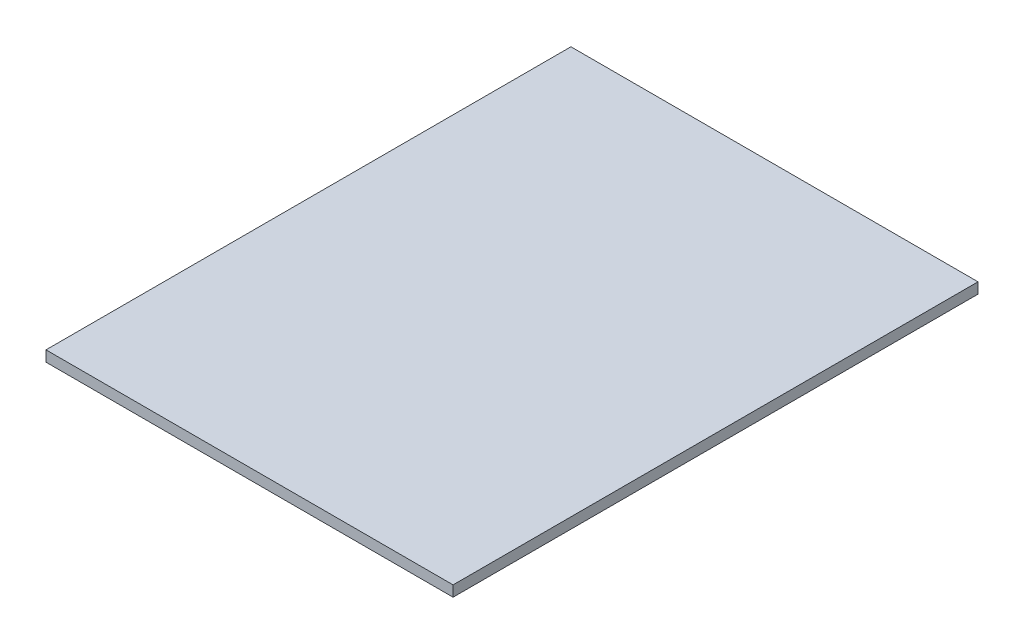
ISO-10303-21;
HEADER;
FILE_DESCRIPTION(('STEP AP214'),'2;1');
FILE_NAME('part.step','',(''),(''),'','','');
FILE_SCHEMA(('AUTOMOTIVE_DESIGN { 1 0 10303 214 1 1 1 1 }'));
ENDSEC;
DATA;
#1=APPLICATION_CONTEXT('core data for automotive mechanical design processes');
#2=APPLICATION_PROTOCOL_DEFINITION('international standard','automotive_design',2000,#1);
#3=PRODUCT_CONTEXT('',#1,'mechanical');
#4=PRODUCT('Part','Part','',(#3));
#5=PRODUCT_RELATED_PRODUCT_CATEGORY('part','',(#4));
#6=PRODUCT_DEFINITION_FORMATION('','',#4);
#7=PRODUCT_DEFINITION_CONTEXT('part definition',#1,'design');
#8=PRODUCT_DEFINITION('design','',#6,#7);
#9=PRODUCT_DEFINITION_SHAPE('','',#8);
#10=(LENGTH_UNIT() NAMED_UNIT(*) SI_UNIT(.MILLI.,.METRE.));
#11=(NAMED_UNIT(*) PLANE_ANGLE_UNIT() SI_UNIT($,.RADIAN.));
#12=(NAMED_UNIT(*) SI_UNIT($,.STERADIAN.) SOLID_ANGLE_UNIT());
#13=UNCERTAINTY_MEASURE_WITH_UNIT(LENGTH_MEASURE(1.E-05),#10,'distance_accuracy_value','');
#14=(GEOMETRIC_REPRESENTATION_CONTEXT(3) GLOBAL_UNCERTAINTY_ASSIGNED_CONTEXT((#13)) GLOBAL_UNIT_ASSIGNED_CONTEXT((#10,
#11,#12)) REPRESENTATION_CONTEXT('',''));
#15=CARTESIAN_POINT('',(0.,0.,0.));
#16=DIRECTION('',(0.,0.,1.));
#17=DIRECTION('',(1.,0.,0.));
#18=AXIS2_PLACEMENT_3D('',#15,#16,#17);
#19=CARTESIAN_POINT('',(241.3,12.7,311.15));
#20=DIRECTION('',(-1.,0.,0.));
#21=DIRECTION('',(0.,0.,1.));
#22=AXIS2_PLACEMENT_3D('',#19,#20,#21);
#23=PLANE('',#22);
#24=DIRECTION('',(0.,0.,-1.));
#25=VECTOR('',#24,1.);
#26=CARTESIAN_POINT('',(241.3,0.,311.15));
#27=LINE('',#26,#25);
#28=CARTESIAN_POINT('',(241.3,0.,311.15));
#29=VERTEX_POINT('',#28);
#30=CARTESIAN_POINT('',(241.3,0.,-311.15));
#31=VERTEX_POINT('',#30);
#32=EDGE_CURVE('E109',#29,#31,#27,.T.);
#33=ORIENTED_EDGE('',*,*,#32,.T.);
#34=DIRECTION('',(0.,-1.,0.));
#35=VECTOR('',#34,1.);
#36=CARTESIAN_POINT('',(241.3,12.7,-311.15));
#37=LINE('',#36,#35);
#38=CARTESIAN_POINT('',(241.3,12.7,-311.15));
#39=VERTEX_POINT('',#38);
#40=EDGE_CURVE('E11',#39,#31,#37,.T.);
#41=ORIENTED_EDGE('',*,*,#40,.F.);
#42=DIRECTION('',(0.,0.,-1.));
#43=VECTOR('',#42,1.);
#44=CARTESIAN_POINT('',(241.3,12.7,311.15));
#45=LINE('',#44,#43);
#46=CARTESIAN_POINT('',(241.3,12.7,311.15));
#47=VERTEX_POINT('',#46);
#48=EDGE_CURVE('E93',#47,#39,#45,.T.);
#49=ORIENTED_EDGE('',*,*,#48,.F.);
#50=DIRECTION('',(0.,-1.,0.));
#51=VECTOR('',#50,1.);
#52=CARTESIAN_POINT('',(241.3,12.7,311.15));
#53=LINE('',#52,#51);
#54=EDGE_CURVE('E105',#47,#29,#53,.T.);
#55=ORIENTED_EDGE('',*,*,#54,.T.);
#56=EDGE_LOOP('',(#33,#41,#49,#55));
#57=FACE_BOUND('',#56,.T.);
#58=ADVANCED_FACE('F41',(#57),#23,.F.);
#59=CARTESIAN_POINT('',(-241.3,12.7,-311.15));
#60=DIRECTION('',(0.,0.,1.));
#61=DIRECTION('',(1.,0.,0.));
#62=AXIS2_PLACEMENT_3D('',#59,#60,#61);
#63=PLANE('',#62);
#64=DIRECTION('',(-1.,0.,0.));
#65=VECTOR('',#64,1.);
#66=CARTESIAN_POINT('',(-241.3,0.,-311.15));
#67=LINE('',#66,#65);
#68=CARTESIAN_POINT('',(-241.3,0.,-311.15));
#69=VERTEX_POINT('',#68);
#70=EDGE_CURVE('E98',#31,#69,#67,.T.);
#71=ORIENTED_EDGE('',*,*,#70,.T.);
#72=DIRECTION('',(0.,-1.,0.));
#73=VECTOR('',#72,1.);
#74=CARTESIAN_POINT('',(-241.3,12.7,-311.15));
#75=LINE('',#74,#73);
#76=CARTESIAN_POINT('',(-241.3,12.7,-311.15));
#77=VERTEX_POINT('',#76);
#78=EDGE_CURVE('E50',#77,#69,#75,.T.);
#79=ORIENTED_EDGE('',*,*,#78,.F.);
#80=DIRECTION('',(-1.,0.,0.));
#81=VECTOR('',#80,1.);
#82=CARTESIAN_POINT('',(-241.3,12.7,-311.15));
#83=LINE('',#82,#81);
#84=EDGE_CURVE('E88',#39,#77,#83,.T.);
#85=ORIENTED_EDGE('',*,*,#84,.F.);
#86=ORIENTED_EDGE('',*,*,#40,.T.);
#87=EDGE_LOOP('',(#71,#79,#85,#86));
#88=FACE_BOUND('',#87,.T.);
#89=ADVANCED_FACE('F97',(#88),#63,.F.);
#90=CARTESIAN_POINT('',(-241.3,12.7,311.15));
#91=DIRECTION('',(1.,0.,0.));
#92=DIRECTION('',(0.,0.,-1.));
#93=AXIS2_PLACEMENT_3D('',#90,#91,#92);
#94=PLANE('',#93);
#95=DIRECTION('',(0.,0.,1.));
#96=VECTOR('',#95,1.);
#97=CARTESIAN_POINT('',(-241.3,0.,311.15));
#98=LINE('',#97,#96);
#99=CARTESIAN_POINT('',(-241.3,0.,311.15));
#100=VERTEX_POINT('',#99);
#101=EDGE_CURVE('E75',#69,#100,#98,.T.);
#102=ORIENTED_EDGE('',*,*,#101,.T.);
#103=DIRECTION('',(0.,-1.,0.));
#104=VECTOR('',#103,1.);
#105=CARTESIAN_POINT('',(-241.3,12.7,311.15));
#106=LINE('',#105,#104);
#107=CARTESIAN_POINT('',(-241.3,12.7,311.15));
#108=VERTEX_POINT('',#107);
#109=EDGE_CURVE('E100',#108,#100,#106,.T.);
#110=ORIENTED_EDGE('',*,*,#109,.F.);
#111=DIRECTION('',(0.,0.,1.));
#112=VECTOR('',#111,1.);
#113=CARTESIAN_POINT('',(-241.3,12.7,311.15));
#114=LINE('',#113,#112);
#115=EDGE_CURVE('E91',#77,#108,#114,.T.);
#116=ORIENTED_EDGE('',*,*,#115,.F.);
#117=ORIENTED_EDGE('',*,*,#78,.T.);
#118=EDGE_LOOP('',(#102,#110,#116,#117));
#119=FACE_BOUND('',#118,.T.);
#120=ADVANCED_FACE('F101',(#119),#94,.F.);
#121=CARTESIAN_POINT('',(-241.3,12.7,311.15));
#122=DIRECTION('',(0.,0.,-1.));
#123=DIRECTION('',(-1.,0.,0.));
#124=AXIS2_PLACEMENT_3D('',#121,#122,#123);
#125=PLANE('',#124);
#126=DIRECTION('',(1.,0.,0.));
#127=VECTOR('',#126,1.);
#128=CARTESIAN_POINT('',(-241.3,0.,311.15));
#129=LINE('',#128,#127);
#130=EDGE_CURVE('E81',#100,#29,#129,.T.);
#131=ORIENTED_EDGE('',*,*,#130,.T.);
#132=ORIENTED_EDGE('',*,*,#54,.F.);
#133=DIRECTION('',(1.,0.,0.));
#134=VECTOR('',#133,1.);
#135=CARTESIAN_POINT('',(-241.3,12.7,311.15));
#136=LINE('',#135,#134);
#137=EDGE_CURVE('E58',#108,#47,#136,.T.);
#138=ORIENTED_EDGE('',*,*,#137,.F.);
#139=ORIENTED_EDGE('',*,*,#109,.T.);
#140=EDGE_LOOP('',(#131,#132,#138,#139));
#141=FACE_BOUND('',#140,.T.);
#142=ADVANCED_FACE('F122',(#141),#125,.F.);
#143=CARTESIAN_POINT('',(0.,12.7,0.));
#144=DIRECTION('',(0.,-1.,0.));
#145=DIRECTION('',(0.,0.,-1.));
#146=AXIS2_PLACEMENT_3D('',#143,#144,#145);
#147=PLANE('',#146);
#148=ORIENTED_EDGE('',*,*,#48,.T.);
#149=ORIENTED_EDGE('',*,*,#84,.T.);
#150=ORIENTED_EDGE('',*,*,#115,.T.);
#151=ORIENTED_EDGE('',*,*,#137,.T.);
#152=EDGE_LOOP('',(#148,#149,#150,#151));
#153=FACE_BOUND('',#152,.T.);
#154=ADVANCED_FACE('F89',(#153),#147,.F.);
#155=CARTESIAN_POINT('',(0.,0.,0.));
#156=DIRECTION('',(0.,-1.,0.));
#157=DIRECTION('',(0.,0.,-1.));
#158=AXIS2_PLACEMENT_3D('',#155,#156,#157);
#159=PLANE('',#158);
#160=ORIENTED_EDGE('',*,*,#32,.F.);
#161=ORIENTED_EDGE('',*,*,#130,.F.);
#162=ORIENTED_EDGE('',*,*,#101,.F.);
#163=ORIENTED_EDGE('',*,*,#70,.F.);
#164=EDGE_LOOP('',(#160,#161,#162,#163));
#165=FACE_BOUND('',#164,.T.);
#166=ADVANCED_FACE('F125',(#165),#159,.T.);
#167=CLOSED_SHELL('',(#58,#89,#120,#142,#154,#166));
#168=MANIFOLD_SOLID_BREP('B2',#167);
#169=ADVANCED_BREP_SHAPE_REPRESENTATION('',(#18,#168),#14);
#170=SHAPE_DEFINITION_REPRESENTATION(#9,#169);
ENDSEC;
END-ISO-10303-21;
